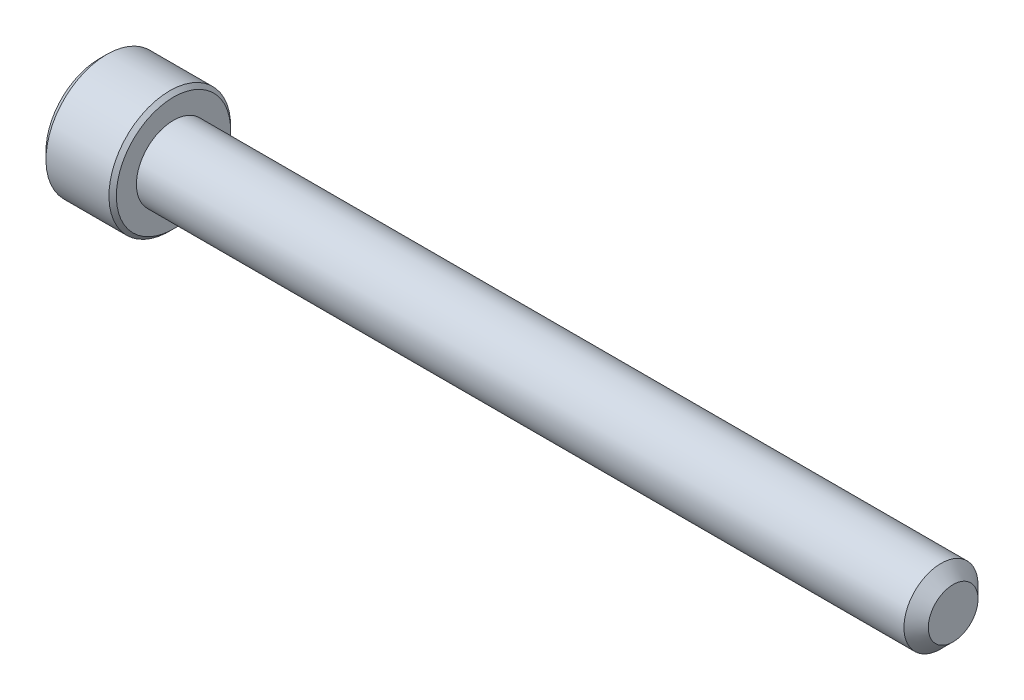
ISO-10303-21;
HEADER;
FILE_DESCRIPTION(('STEP AP214'),'2;1');
FILE_NAME('part.step','',(''),(''),'','','');
FILE_SCHEMA(('AUTOMOTIVE_DESIGN { 1 0 10303 214 1 1 1 1 }'));
ENDSEC;
DATA;
#1=APPLICATION_CONTEXT('core data for automotive mechanical design processes');
#2=APPLICATION_PROTOCOL_DEFINITION('international standard','automotive_design',2000,#1);
#3=PRODUCT_CONTEXT('',#1,'mechanical');
#4=PRODUCT('Part','Part','',(#3));
#5=PRODUCT_RELATED_PRODUCT_CATEGORY('part','',(#4));
#6=PRODUCT_DEFINITION_FORMATION('','',#4);
#7=PRODUCT_DEFINITION_CONTEXT('part definition',#1,'design');
#8=PRODUCT_DEFINITION('design','',#6,#7);
#9=PRODUCT_DEFINITION_SHAPE('','',#8);
#10=(LENGTH_UNIT() NAMED_UNIT(*) SI_UNIT(.MILLI.,.METRE.));
#11=(NAMED_UNIT(*) PLANE_ANGLE_UNIT() SI_UNIT($,.RADIAN.));
#12=(NAMED_UNIT(*) SI_UNIT($,.STERADIAN.) SOLID_ANGLE_UNIT());
#13=UNCERTAINTY_MEASURE_WITH_UNIT(LENGTH_MEASURE(1.E-05),#10,'distance_accuracy_value','');
#14=(GEOMETRIC_REPRESENTATION_CONTEXT(3) GLOBAL_UNCERTAINTY_ASSIGNED_CONTEXT((#13)) GLOBAL_UNIT_ASSIGNED_CONTEXT((#10,
#11,#12)) REPRESENTATION_CONTEXT('',''));
#15=CARTESIAN_POINT('',(0.,0.,0.));
#16=DIRECTION('',(0.,0.,1.));
#17=DIRECTION('',(1.,0.,0.));
#18=AXIS2_PLACEMENT_3D('',#15,#16,#17);
#19=CARTESIAN_POINT('',(-30.226,3.47979999999999,0.));
#20=DIRECTION('',(-1.,0.,0.));
#21=DIRECTION('',(0.,-1.,0.));
#22=AXIS2_PLACEMENT_3D('',#19,#20,#21);
#23=PLANE('',#22);
#24=CARTESIAN_POINT('',(-30.226,0.,0.));
#25=DIRECTION('',(-1.,0.,0.));
#26=DIRECTION('',(0.,-1.,0.));
#27=AXIS2_PLACEMENT_3D('',#24,#25,#26);
#28=CIRCLE('',#27,2.28769270663693);
#29=CARTESIAN_POINT('',(-30.226,-2.28769270663684,-2.29850860566927E-13));
#30=VERTEX_POINT('',#29);
#31=CARTESIAN_POINT('',(-30.226,-1.14384635331858,1.98119999999985));
#32=VERTEX_POINT('',#31);
#33=EDGE_CURVE('E129',#30,#32,#28,.T.);
#34=ORIENTED_EDGE('',*,*,#33,.F.);
#35=CARTESIAN_POINT('',(-30.226,-1.14384635331849,-1.9812));
#36=VERTEX_POINT('',#35);
#37=EDGE_CURVE('E128',#36,#30,#28,.T.);
#38=ORIENTED_EDGE('',*,*,#37,.F.);
#39=CARTESIAN_POINT('',(-30.226,1.14384635331849,-1.9812));
#40=VERTEX_POINT('',#39);
#41=EDGE_CURVE('E98',#40,#36,#28,.T.);
#42=ORIENTED_EDGE('',*,*,#41,.F.);
#43=CARTESIAN_POINT('',(-30.226,2.28769270663702,0.));
#44=VERTEX_POINT('',#43);
#45=EDGE_CURVE('E91',#44,#40,#28,.T.);
#46=ORIENTED_EDGE('',*,*,#45,.F.);
#47=CARTESIAN_POINT('',(-30.226,1.14384635331848,1.9812));
#48=VERTEX_POINT('',#47);
#49=EDGE_CURVE('E52',#48,#44,#28,.T.);
#50=ORIENTED_EDGE('',*,*,#49,.F.);
#51=EDGE_CURVE('E59',#32,#48,#28,.T.);
#52=ORIENTED_EDGE('',*,*,#51,.F.);
#53=EDGE_LOOP('',(#34,#38,#42,#46,#50,#52));
#54=FACE_BOUND('',#53,.T.);
#55=CARTESIAN_POINT('',(-30.226,0.,0.));
#56=DIRECTION('',(1.,0.,0.));
#57=DIRECTION('',(0.,1.,0.));
#58=AXIS2_PLACEMENT_3D('',#55,#56,#57);
#59=CIRCLE('',#58,3.4798);
#60=CARTESIAN_POINT('',(-30.226,3.47979999999999,0.));
#61=VERTEX_POINT('',#60);
#62=EDGE_CURVE('E217',#61,#61,#59,.T.);
#63=ORIENTED_EDGE('',*,*,#62,.F.);
#64=EDGE_LOOP('',(#63));
#65=FACE_BOUND('',#64,.T.);
#66=ADVANCED_FACE('F33',(#54,#65),#23,.T.);
#67=CARTESIAN_POINT('',(-25.4,0.,0.));
#68=DIRECTION('',(1.,0.,0.));
#69=DIRECTION('',(0.,0.,-1.));
#70=AXIS2_PLACEMENT_3D('',#67,#68,#69);
#71=CYLINDRICAL_SURFACE('',#70,2.41299999999999);
#72=CARTESIAN_POINT('',(24.60625,0.,0.));
#73=DIRECTION('',(1.,0.,0.));
#74=DIRECTION('',(0.,0.,-1.));
#75=AXIS2_PLACEMENT_3D('',#72,#73,#74);
#76=CIRCLE('',#75,2.41299999999999);
#77=CARTESIAN_POINT('',(24.60625,0.,-2.41299999999999));
#78=VERTEX_POINT('',#77);
#79=EDGE_CURVE('E46',#78,#78,#76,.F.);
#80=ORIENTED_EDGE('',*,*,#79,.T.);
#81=EDGE_LOOP('',(#80));
#82=FACE_BOUND('',#81,.T.);
#83=CARTESIAN_POINT('',(-25.4,0.,0.));
#84=DIRECTION('',(1.,0.,0.));
#85=DIRECTION('',(0.,1.,0.));
#86=AXIS2_PLACEMENT_3D('',#83,#84,#85);
#87=CIRCLE('',#86,2.41299999999999);
#88=CARTESIAN_POINT('',(-25.4,2.41299999999999,0.));
#89=VERTEX_POINT('',#88);
#90=EDGE_CURVE('E210',#89,#89,#87,.F.);
#91=ORIENTED_EDGE('',*,*,#90,.F.);
#92=EDGE_LOOP('',(#91));
#93=FACE_BOUND('',#92,.T.);
#94=ADVANCED_FACE('F190',(#82,#93),#71,.T.);
#95=CARTESIAN_POINT('',(25.4,0.,0.));
#96=DIRECTION('',(1.,0.,0.));
#97=DIRECTION('',(0.,0.,-1.));
#98=AXIS2_PLACEMENT_3D('',#95,#96,#97);
#99=PLANE('',#98);
#100=CARTESIAN_POINT('',(25.4,0.,0.));
#101=DIRECTION('',(1.,0.,0.));
#102=DIRECTION('',(0.,0.,-1.));
#103=AXIS2_PLACEMENT_3D('',#100,#101,#102);
#104=CIRCLE('',#103,1.61924999999999);
#105=CARTESIAN_POINT('',(25.4,0.,-1.61924999999999));
#106=VERTEX_POINT('',#105);
#107=EDGE_CURVE('E211',#106,#106,#104,.T.);
#108=ORIENTED_EDGE('',*,*,#107,.T.);
#109=EDGE_LOOP('',(#108));
#110=FACE_BOUND('',#109,.T.);
#111=ADVANCED_FACE('F198',(#110),#99,.T.);
#112=CARTESIAN_POINT('',(25.4,0.,0.));
#113=DIRECTION('',(-1.,0.,0.));
#114=DIRECTION('',(0.,0.,1.));
#115=AXIS2_PLACEMENT_3D('',#112,#113,#114);
#116=CONICAL_SURFACE('',#115,1.61924999999999,0.785398163397446);
#117=ORIENTED_EDGE('',*,*,#79,.F.);
#118=EDGE_LOOP('',(#117));
#119=FACE_BOUND('',#118,.T.);
#120=ORIENTED_EDGE('',*,*,#107,.F.);
#121=EDGE_LOOP('',(#120));
#122=FACE_BOUND('',#121,.T.);
#123=ADVANCED_FACE('F35',(#119,#122),#116,.T.);
#124=CARTESIAN_POINT('',(-25.4,0.,0.));
#125=DIRECTION('',(1.,0.,0.));
#126=DIRECTION('',(0.,1.,0.));
#127=AXIS2_PLACEMENT_3D('',#124,#125,#126);
#128=CYLINDRICAL_SURFACE('',#127,3.9624);
#129=CARTESIAN_POINT('',(-29.7434,0.,0.));
#130=DIRECTION('',(1.,0.,0.));
#131=DIRECTION('',(0.,1.,0.));
#132=AXIS2_PLACEMENT_3D('',#129,#130,#131);
#133=CIRCLE('',#132,3.9624);
#134=CARTESIAN_POINT('',(-29.7434,3.96239999999999,0.));
#135=VERTEX_POINT('',#134);
#136=EDGE_CURVE('E212',#135,#135,#133,.T.);
#137=ORIENTED_EDGE('',*,*,#136,.T.);
#138=EDGE_LOOP('',(#137));
#139=FACE_BOUND('',#138,.T.);
#140=CARTESIAN_POINT('',(-25.6413,0.,0.));
#141=DIRECTION('',(1.,0.,0.));
#142=DIRECTION('',(0.,1.,0.));
#143=AXIS2_PLACEMENT_3D('',#140,#141,#142);
#144=CIRCLE('',#143,3.9624);
#145=CARTESIAN_POINT('',(-25.6413,3.9624,0.));
#146=VERTEX_POINT('',#145);
#147=EDGE_CURVE('E225',#146,#146,#144,.T.);
#148=ORIENTED_EDGE('',*,*,#147,.F.);
#149=EDGE_LOOP('',(#148));
#150=FACE_BOUND('',#149,.T.);
#151=ADVANCED_FACE('F193',(#139,#150),#128,.T.);
#152=CARTESIAN_POINT('',(-29.7434,0.,0.));
#153=DIRECTION('',(1.,0.,0.));
#154=DIRECTION('',(0.,1.,0.));
#155=AXIS2_PLACEMENT_3D('',#152,#153,#154);
#156=CONICAL_SURFACE('',#155,3.9624,0.785398163397451);
#157=ORIENTED_EDGE('',*,*,#62,.T.);
#158=EDGE_LOOP('',(#157));
#159=FACE_BOUND('',#158,.T.);
#160=ORIENTED_EDGE('',*,*,#136,.F.);
#161=EDGE_LOOP('',(#160));
#162=FACE_BOUND('',#161,.T.);
#163=ADVANCED_FACE('F186',(#159,#162),#156,.T.);
#164=CARTESIAN_POINT('',(-25.4,3.7211,0.));
#165=DIRECTION('',(1.,0.,0.));
#166=DIRECTION('',(0.,1.,0.));
#167=AXIS2_PLACEMENT_3D('',#164,#165,#166);
#168=PLANE('',#167);
#169=ORIENTED_EDGE('',*,*,#90,.T.);
#170=EDGE_LOOP('',(#169));
#171=FACE_BOUND('',#170,.T.);
#172=CARTESIAN_POINT('',(-25.4,0.,0.));
#173=DIRECTION('',(1.,0.,0.));
#174=DIRECTION('',(0.,1.,0.));
#175=AXIS2_PLACEMENT_3D('',#172,#173,#174);
#176=CIRCLE('',#175,3.7211);
#177=CARTESIAN_POINT('',(-25.4,3.7211,0.));
#178=VERTEX_POINT('',#177);
#179=EDGE_CURVE('E222',#178,#178,#176,.T.);
#180=ORIENTED_EDGE('',*,*,#179,.T.);
#181=EDGE_LOOP('',(#180));
#182=FACE_BOUND('',#181,.T.);
#183=ADVANCED_FACE('F182',(#171,#182),#168,.T.);
#184=CARTESIAN_POINT('',(-25.4,0.,0.));
#185=DIRECTION('',(-1.,0.,0.));
#186=DIRECTION('',(0.,-1.,0.));
#187=AXIS2_PLACEMENT_3D('',#184,#185,#186);
#188=CONICAL_SURFACE('',#187,3.7211,0.785398163397448);
#189=ORIENTED_EDGE('',*,*,#147,.T.);
#190=EDGE_LOOP('',(#189));
#191=FACE_BOUND('',#190,.T.);
#192=ORIENTED_EDGE('',*,*,#179,.F.);
#193=EDGE_LOOP('',(#192));
#194=FACE_BOUND('',#193,.T.);
#195=ADVANCED_FACE('F149',(#191,#194),#188,.T.);
#196=CARTESIAN_POINT('',(-30.226,0.,0.));
#197=DIRECTION('',(-1.,0.,0.));
#198=DIRECTION('',(0.,-1.,0.));
#199=AXIS2_PLACEMENT_3D('',#196,#197,#198);
#200=CONICAL_SURFACE('',#199,2.28769270663693,0.78539816339745);
#201=CARTESIAN_POINT('',(-30.9865600777253,-2.31661209471328,-1.9812));
#202=CARTESIAN_POINT('',(-30.9438204101819,-2.2603614921634,-1.9812));
#203=CARTESIAN_POINT('',(-30.9014834228159,-2.20379992870606,-1.9812));
#204=CARTESIAN_POINT('',(-30.8177963532882,-2.08993070629047,-1.9812));
#205=CARTESIAN_POINT('',(-30.7764465165402,-2.03262286716362,-1.9812));
#206=CARTESIAN_POINT('',(-30.6946210740377,-1.91671767305174,-1.9812));
#207=CARTESIAN_POINT('',(-30.6541547119404,-1.85811377040503,-1.9812));
#208=CARTESIAN_POINT('',(-30.5746970580368,-1.73991751157362,-1.9812));
#209=CARTESIAN_POINT('',(-30.5357056629739,-1.68032522500334,-1.9812));
#210=CARTESIAN_POINT('',(-30.4572729813758,-1.55642857644237,-1.9812));
#211=CARTESIAN_POINT('',(-30.4179417996365,-1.49205415836947,-1.9812));
#212=CARTESIAN_POINT('',(-30.3418158217768,-1.36179799931495,-1.9812));
#213=CARTESIAN_POINT('',(-30.3050214801781,-1.29591599102244,-1.9812));
#214=CARTESIAN_POINT('',(-30.2347629165456,-1.16264841649048,-1.9812));
#215=CARTESIAN_POINT('',(-30.2012886854463,-1.09526816863771,-1.9812));
#216=CARTESIAN_POINT('',(-30.138413001948,-0.958638525880335,-1.9812));
#217=CARTESIAN_POINT('',(-30.1090101814703,-0.889389768225115,-1.9812));
#218=CARTESIAN_POINT('',(-30.0576670535846,-0.755011676695663,-1.9812));
#219=CARTESIAN_POINT('',(-30.0353004028526,-0.690046933259606,-1.9812));
#220=CARTESIAN_POINT('',(-29.9957743614793,-0.558522492136709,-1.9812));
#221=CARTESIAN_POINT('',(-29.9786153199098,-0.491962687853754,-1.9812));
#222=CARTESIAN_POINT('',(-29.9506968812676,-0.35876983400334,-1.9812));
#223=CARTESIAN_POINT('',(-29.9398256504206,-0.292160618416792,-1.9812));
#224=CARTESIAN_POINT('',(-29.9246994731351,-0.158191123948833,-1.9812));
#225=CARTESIAN_POINT('',(-29.9204433141166,-0.0908309849964729,-1.9812));
#226=CARTESIAN_POINT('',(-29.9188791538644,0.0413675255867971,-1.9812));
#227=CARTESIAN_POINT('',(-29.9213092898238,0.106202871329352,-1.9812));
#228=CARTESIAN_POINT('',(-29.9323974368111,0.235335017945305,-1.9812));
#229=CARTESIAN_POINT('',(-29.9410560404723,0.299631766982711,-1.9812));
#230=CARTESIAN_POINT('',(-29.9642695211888,0.42831037460898,-1.9812));
#231=CARTESIAN_POINT('',(-29.9789259856142,0.492673621191191,-1.9812));
#232=CARTESIAN_POINT('',(-30.0133456029653,0.619989310450822,-1.9812));
#233=CARTESIAN_POINT('',(-30.0331083735679,0.682941858367764,-1.9812));
#234=CARTESIAN_POINT('',(-30.1023096371758,0.879557414350364,-1.9812));
#235=CARTESIAN_POINT('',(-30.1595631983677,1.010461173405,-1.9812));
#236=CARTESIAN_POINT('',(-30.2869025411665,1.26614292755427,-1.9812));
#237=CARTESIAN_POINT('',(-30.3570341080232,1.39089698474677,-1.9812));
#238=CARTESIAN_POINT('',(-30.4665063539928,1.57122009754463,-1.9812));
#239=CARTESIAN_POINT('',(-30.502693344133,1.62874196367695,-1.9812));
#240=CARTESIAN_POINT('',(-30.5766029768938,1.74279825856359,-1.9812));
#241=CARTESIAN_POINT('',(-30.614325735426,1.7993326123238,-1.9812));
#242=CARTESIAN_POINT('',(-30.6907156093157,1.9110856137449,-1.9812));
#243=CARTESIAN_POINT('',(-30.729372617531,1.96631120499263,-1.9812));
#244=CARTESIAN_POINT('',(-30.8077142557783,2.07600654074471,-1.9812));
#245=CARTESIAN_POINT('',(-30.8473985999833,2.13047648914331,-1.9812));
#246=CARTESIAN_POINT('',(-30.8875039684054,2.18462985150372,-1.9812));
#247=B_SPLINE_CURVE_WITH_KNOTS('',3,(#201,#202,#203,#204,#205,#206,#207,#208,#209,#210,#211,
#212,#213,#214,#215,#216,#217,#218,#219,#220,#221,#222,#223,#224,#225,#226,#227,#228,#229,#230,
#231,#232,#233,#234,#235,#236,#237,#238,#239,#240,#241,#242,#243,#244,#245,#246),.UNSPECIFIED.,
.F.,.F.,(4,2,2,2,2,2,2,2,2,2,2,2,2,2,2,2,2,2,2,2,2,2,4),(0.,0.211941073069261,0.42393429897997,
0.637568344044451,0.85118740567587,1.07745720435396,1.30376743866492,1.52937324449065,
1.75490305715754,1.96084491037234,2.16680056504197,2.3689705744368,2.57110352055404,
2.76543396935549,2.95978291097833,3.15756960318856,3.35534149086081,3.7827240030036,
4.21165649261165,4.41551067240028,4.61938026665561,4.82160076405437,5.02376559149012),.UNSPECIFIED.);
#248=EDGE_CURVE('E11',#36,#40,#247,.T.);
#249=ORIENTED_EDGE('',*,*,#248,.T.);
#250=ORIENTED_EDGE('',*,*,#41,.T.);
#251=EDGE_LOOP('',(#249,#250));
#252=FACE_BOUND('',#251,.T.);
#253=ADVANCED_FACE('F103',(#252),#200,.F.);
#254=CARTESIAN_POINT('',(-30.226115478796,-2.28780817669081,0.000200000000000626));
#255=CARTESIAN_POINT('',(-30.1868257959103,-2.24848665761523,-0.0679068688696917));
#256=CARTESIAN_POINT('',(-30.1498435003289,-2.20850761153497,-0.137152607918836));
#257=CARTESIAN_POINT('',(-30.0821295256354,-2.12698582564064,-0.278352483011571));
#258=CARTESIAN_POINT('',(-30.0514355270599,-2.08543533121811,-0.350320050431004));
#259=CARTESIAN_POINT('',(-29.998855956616,-2.00165072213424,-0.495439250256557));
#260=CARTESIAN_POINT('',(-29.9768382144166,-1.95943794971066,-0.568553916822545));
#261=CARTESIAN_POINT('',(-29.9429151727618,-1.87408300871192,-0.716393011309414));
#262=CARTESIAN_POINT('',(-29.9309845470076,-1.83094344831493,-0.791112921733183));
#263=CARTESIAN_POINT('',(-29.9202201335962,-1.75659617238784,-0.919886181043241));
#264=CARTESIAN_POINT('',(-29.9186264854144,-1.72548453026022,-0.973773125915175));
#265=CARTESIAN_POINT('',(-29.9213101205948,-1.6633120865558,-1.08145895724194));
#266=CARTESIAN_POINT('',(-29.9255894623054,-1.63225130662553,-1.1352578062039));
#267=CARTESIAN_POINT('',(-29.9397755575124,-1.5704230164257,-1.24234754617512));
#268=CARTESIAN_POINT('',(-29.9496886071672,-1.53965587350492,-1.29563780091763));
#269=CARTESIAN_POINT('',(-29.9745979595727,-1.478653620299,-1.40129680284647));
#270=CARTESIAN_POINT('',(-29.9895938726795,-1.44841846941905,-1.45366562034505));
#271=CARTESIAN_POINT('',(-30.0341153639915,-1.37096856578664,-1.58781278847771));
#272=CARTESIAN_POINT('',(-30.066997840542,-1.32423416327347,-1.66875914809188));
#273=CARTESIAN_POINT('',(-30.1225083779863,-1.25551545359429,-1.78778344468681));
#274=CARTESIAN_POINT('',(-30.1420122911182,-1.23286958858003,-1.82700723347285));
#275=CARTESIAN_POINT('',(-30.1827981146138,-1.18799738117061,-1.90472817655373));
#276=CARTESIAN_POINT('',(-30.2040789329533,-1.16577079125223,-1.94322575957137));
#277=CARTESIAN_POINT('',(-30.2261154787959,-1.14373088326465,-1.9814));
#278=B_SPLINE_CURVE_WITH_KNOTS('',3,(#254,#255,#256,#257,#258,#259,#260,#261,#262,#263,#264,
#265,#266,#267,#268,#269,#270,#271,#272,#273,#274,#275,#276,#277),.UNSPECIFIED.,.F.,.F.,(4,2,2,
2,2,2,2,2,2,2,2,4),(0.,0.26391677446681,0.529371490731501,0.790609676105219,1.0511899914388,
1.23765676959447,1.42418891677611,1.61092994095409,1.79765665311273,2.09428646526811,
2.24219924134225,2.39002177516371),.UNSPECIFIED.);
#279=EDGE_CURVE('E131',#30,#36,#278,.T.);
#280=ORIENTED_EDGE('',*,*,#279,.T.);
#281=ORIENTED_EDGE('',*,*,#37,.T.);
#282=EDGE_LOOP('',(#280,#281));
#283=FACE_BOUND('',#282,.T.);
#284=ADVANCED_FACE('F148',(#283),#200,.F.);
#285=CARTESIAN_POINT('',(-30.2261154787959,-1.14373088326465,1.9814));
#286=CARTESIAN_POINT('',(-30.1868257959103,-1.18305240234023,1.91329313113031));
#287=CARTESIAN_POINT('',(-30.1498435003289,-1.22303144842048,1.84404739208117));
#288=CARTESIAN_POINT('',(-30.0821295256354,-1.30455323431481,1.70284751698845));
#289=CARTESIAN_POINT('',(-30.0514355270599,-1.34610372873734,1.63087994956902));
#290=CARTESIAN_POINT('',(-29.998855956616,-1.4298883378212,1.48576074974348));
#291=CARTESIAN_POINT('',(-29.9768382144166,-1.47210111024478,1.41264608317749));
#292=CARTESIAN_POINT('',(-29.9429151727618,-1.55745605124351,1.26480698869064));
#293=CARTESIAN_POINT('',(-29.9309845470076,-1.6005956116405,1.19008707826687));
#294=CARTESIAN_POINT('',(-29.9202201335962,-1.67494288756758,1.06131381895682));
#295=CARTESIAN_POINT('',(-29.9186264854144,-1.7060545296952,1.00742687408489));
#296=CARTESIAN_POINT('',(-29.9213101205948,-1.76822697339962,0.899741042758117));
#297=CARTESIAN_POINT('',(-29.9255894623054,-1.7992877533299,0.845942193796162));
#298=CARTESIAN_POINT('',(-29.9397755575124,-1.86111604352973,0.738852453824941));
#299=CARTESIAN_POINT('',(-29.9496886071672,-1.8918831864505,0.685562199082431));
#300=CARTESIAN_POINT('',(-29.9745979595727,-1.95288543965642,0.579903197153589));
#301=CARTESIAN_POINT('',(-29.9895938726795,-1.98312059053637,0.527534379655012));
#302=CARTESIAN_POINT('',(-30.0341153639915,-2.06057049416879,0.393387211522345));
#303=CARTESIAN_POINT('',(-30.066997840542,-2.10730489668196,0.312440851908157));
#304=CARTESIAN_POINT('',(-30.1225083779863,-2.17602360636116,0.193416555313217));
#305=CARTESIAN_POINT('',(-30.1420122911183,-2.19866947137542,0.154192766527167));
#306=CARTESIAN_POINT('',(-30.1827981146138,-2.24354167878484,0.0764718234462842));
#307=CARTESIAN_POINT('',(-30.2040789329534,-2.26576826870323,0.0379742404286395));
#308=CARTESIAN_POINT('',(-30.226115478796,-2.28780817669081,-0.000199999999999256));
#309=B_SPLINE_CURVE_WITH_KNOTS('',3,(#285,#286,#287,#288,#289,#290,#291,#292,#293,#294,#295,
#296,#297,#298,#299,#300,#301,#302,#303,#304,#305,#306,#307,#308),.UNSPECIFIED.,.F.,.F.,(4,2,2,
2,2,2,2,2,2,2,2,4),(0.,0.263916774466789,0.529371490731459,0.790609676105156,1.05118999143872,
1.23765676959439,1.42418891677603,1.61092994095401,1.79765665311265,2.09428646526807,
2.24219924134223,2.39002177516371),.UNSPECIFIED.);
#310=EDGE_CURVE('E137',#32,#30,#309,.T.);
#311=ORIENTED_EDGE('',*,*,#310,.T.);
#312=ORIENTED_EDGE('',*,*,#33,.T.);
#313=EDGE_LOOP('',(#311,#312));
#314=FACE_BOUND('',#313,.T.);
#315=ADVANCED_FACE('F258',(#314),#200,.F.);
#316=CARTESIAN_POINT('',(-30.9865600777253,-2.31661209471328,1.9812));
#317=CARTESIAN_POINT('',(-30.9438204101819,-2.2603614921634,1.9812));
#318=CARTESIAN_POINT('',(-30.9014834228159,-2.20379992870606,1.9812));
#319=CARTESIAN_POINT('',(-30.8177963532882,-2.08993070629047,1.9812));
#320=CARTESIAN_POINT('',(-30.7764465165402,-2.03262286716362,1.9812));
#321=CARTESIAN_POINT('',(-30.6946210740377,-1.91671767305173,1.9812));
#322=CARTESIAN_POINT('',(-30.6541547119404,-1.85811377040503,1.9812));
#323=CARTESIAN_POINT('',(-30.5746970580368,-1.73991751157362,1.9812));
#324=CARTESIAN_POINT('',(-30.5357056629739,-1.68032522500334,1.9812));
#325=CARTESIAN_POINT('',(-30.4572729813758,-1.55642857644237,1.9812));
#326=CARTESIAN_POINT('',(-30.4179417996365,-1.49205415836947,1.9812));
#327=CARTESIAN_POINT('',(-30.3418158217768,-1.36179799931495,1.9812));
#328=CARTESIAN_POINT('',(-30.3050214801781,-1.29591599102244,1.9812));
#329=CARTESIAN_POINT('',(-30.2347629165456,-1.16264841649048,1.9812));
#330=CARTESIAN_POINT('',(-30.2012886854463,-1.0952681686377,1.9812));
#331=CARTESIAN_POINT('',(-30.138413001948,-0.958638525880333,1.9812));
#332=CARTESIAN_POINT('',(-30.1090101814703,-0.889389768225113,1.9812));
#333=CARTESIAN_POINT('',(-30.0576670535846,-0.755011676695663,1.9812));
#334=CARTESIAN_POINT('',(-30.0353004028526,-0.690046933259605,1.9812));
#335=CARTESIAN_POINT('',(-29.9957743614793,-0.558522492136708,1.9812));
#336=CARTESIAN_POINT('',(-29.9786153199098,-0.491962687853753,1.9812));
#337=CARTESIAN_POINT('',(-29.9506968812676,-0.358769834003338,1.9812));
#338=CARTESIAN_POINT('',(-29.9398256504206,-0.292160618416791,1.9812));
#339=CARTESIAN_POINT('',(-29.9246994731351,-0.158191123948832,1.9812));
#340=CARTESIAN_POINT('',(-29.9204433141166,-0.0908309849964719,1.9812));
#341=CARTESIAN_POINT('',(-29.9188791538644,0.041367525586798,1.9812));
#342=CARTESIAN_POINT('',(-29.9213092898238,0.106202871329352,1.9812));
#343=CARTESIAN_POINT('',(-29.9323974368111,0.235335017945306,1.9812));
#344=CARTESIAN_POINT('',(-29.9410560404723,0.299631766982712,1.9812));
#345=CARTESIAN_POINT('',(-29.9642695211888,0.428310374608981,1.9812));
#346=CARTESIAN_POINT('',(-29.9789259856142,0.492673621191193,1.9812));
#347=CARTESIAN_POINT('',(-30.0133456029653,0.619989310450825,1.9812));
#348=CARTESIAN_POINT('',(-30.0331083735679,0.682941858367766,1.9812));
#349=CARTESIAN_POINT('',(-30.1023096371758,0.879557414350365,1.9812));
#350=CARTESIAN_POINT('',(-30.1595631983677,1.010461173405,1.9812));
#351=CARTESIAN_POINT('',(-30.2869025411665,1.26614292755427,1.9812));
#352=CARTESIAN_POINT('',(-30.3570341080232,1.39089698474677,1.9812));
#353=CARTESIAN_POINT('',(-30.4665063539928,1.57122009754464,1.9812));
#354=CARTESIAN_POINT('',(-30.502693344133,1.62874196367696,1.9812));
#355=CARTESIAN_POINT('',(-30.5766029768938,1.7427982585636,1.9812));
#356=CARTESIAN_POINT('',(-30.614325735426,1.7993326123238,1.9812));
#357=CARTESIAN_POINT('',(-30.6907156093157,1.91108561374491,1.9812));
#358=CARTESIAN_POINT('',(-30.729372617531,1.96631120499263,1.9812));
#359=CARTESIAN_POINT('',(-30.8077142557783,2.07600654074471,1.9812));
#360=CARTESIAN_POINT('',(-30.8473985999833,2.13047648914332,1.9812));
#361=CARTESIAN_POINT('',(-30.8875039684054,2.18462985150372,1.9812));
#362=B_SPLINE_CURVE_WITH_KNOTS('',3,(#316,#317,#318,#319,#320,#321,#322,#323,#324,#325,#326,
#327,#328,#329,#330,#331,#332,#333,#334,#335,#336,#337,#338,#339,#340,#341,#342,#343,#344,#345,
#346,#347,#348,#349,#350,#351,#352,#353,#354,#355,#356,#357,#358,#359,#360,#361),.UNSPECIFIED.,
.F.,.F.,(4,2,2,2,2,2,2,2,2,2,2,2,2,2,2,2,2,2,2,2,2,2,4),(0.,0.211941073069261,0.42393429897997,
0.637568344044451,0.85118740567587,1.07745720435396,1.30376743866492,1.52937324449065,
1.75490305715754,1.96084491037234,2.16680056504197,2.3689705744368,2.57110352055404,
2.76543396935549,2.95978291097833,3.15756960318856,3.35534149086082,3.7827240030036,
4.21165649261165,4.41551067240028,4.61938026665562,4.82160076405437,5.02376559149013),.UNSPECIFIED.);
#363=EDGE_CURVE('E156',#48,#32,#362,.F.);
#364=ORIENTED_EDGE('',*,*,#363,.T.);
#365=ORIENTED_EDGE('',*,*,#51,.T.);
#366=EDGE_LOOP('',(#364,#365));
#367=FACE_BOUND('',#366,.T.);
#368=ADVANCED_FACE('F274',(#367),#200,.F.);
#369=CARTESIAN_POINT('',(-30.2261154787958,2.28780817669081,-0.000199999999999572));
#370=CARTESIAN_POINT('',(-30.1868257959102,2.24848665761523,0.0679068688696886));
#371=CARTESIAN_POINT('',(-30.1498435003287,2.20850761153498,0.137152607918827));
#372=CARTESIAN_POINT('',(-30.0821295256353,2.12698582564065,0.278352483011551));
#373=CARTESIAN_POINT('',(-30.0514355270598,2.08543533121812,0.350320050430979));
#374=CARTESIAN_POINT('',(-29.9988559566158,2.00165072213426,0.495439250256521));
#375=CARTESIAN_POINT('',(-29.9768382144164,1.95943794971068,0.568553916822504));
#376=CARTESIAN_POINT('',(-29.9429151727616,1.87408300871195,0.716393011309361));
#377=CARTESIAN_POINT('',(-29.9309845470074,1.83094344831496,0.791112921733124));
#378=CARTESIAN_POINT('',(-29.9202201335961,1.75659617238788,0.919886181043174));
#379=CARTESIAN_POINT('',(-29.9186264854143,1.72548453026026,0.973773125915103));
#380=CARTESIAN_POINT('',(-29.9213101205947,1.66331208655585,1.08145895724186));
#381=CARTESIAN_POINT('',(-29.9255894623052,1.63225130662558,1.13525780620382));
#382=CARTESIAN_POINT('',(-29.9397755575122,1.57042301642575,1.24234754617503));
#383=CARTESIAN_POINT('',(-29.949688607167,1.53965587350498,1.29563780091754));
#384=CARTESIAN_POINT('',(-29.9745979595725,1.47865362029906,1.40129680284637));
#385=CARTESIAN_POINT('',(-29.9895938726794,1.44841846941911,1.45366562034494));
#386=CARTESIAN_POINT('',(-30.0341153639914,1.37096856578669,1.58781278847762));
#387=CARTESIAN_POINT('',(-30.0669978405418,1.32423416327351,1.66875914809181));
#388=CARTESIAN_POINT('',(-30.1225083779862,1.25551545359431,1.78778344468677));
#389=CARTESIAN_POINT('',(-30.1420122911181,1.23286958858005,1.82700723347282));
#390=CARTESIAN_POINT('',(-30.1827981146137,1.18799738117062,1.90472817655371));
#391=CARTESIAN_POINT('',(-30.2040789329532,1.16577079125223,1.94322575957136));
#392=CARTESIAN_POINT('',(-30.2261154787958,1.14373088326465,1.9814));
#393=B_SPLINE_CURVE_WITH_KNOTS('',3,(#369,#370,#371,#372,#373,#374,#375,#376,#377,#378,#379,
#380,#381,#382,#383,#384,#385,#386,#387,#388,#389,#390,#391,#392),.UNSPECIFIED.,.F.,.F.,(4,2,2,
2,2,2,2,2,2,2,2,4),(0.,0.263916774466789,0.52937149073146,0.790609676105156,1.05118999143872,
1.23765676959438,1.424188916776,1.61092994095397,1.7976566531126,2.09428646526805,
2.24219924134222,2.39002177516373),.UNSPECIFIED.);
#394=EDGE_CURVE('E118',#44,#48,#393,.T.);
#395=ORIENTED_EDGE('',*,*,#394,.T.);
#396=ORIENTED_EDGE('',*,*,#49,.T.);
#397=EDGE_LOOP('',(#395,#396));
#398=FACE_BOUND('',#397,.T.);
#399=ADVANCED_FACE('F250',(#398),#200,.F.);
#400=CARTESIAN_POINT('',(-30.2261154787958,1.14373088326465,-1.9814));
#401=CARTESIAN_POINT('',(-30.1868257959102,1.18305240234023,-1.91329313113031));
#402=CARTESIAN_POINT('',(-30.1498435003288,1.22303144842049,-1.84404739208116));
#403=CARTESIAN_POINT('',(-30.0821295256353,1.30455323431482,-1.70284751698843));
#404=CARTESIAN_POINT('',(-30.0514355270598,1.34610372873735,-1.630879949569));
#405=CARTESIAN_POINT('',(-29.9988559566158,1.42988833782121,-1.48576074974345));
#406=CARTESIAN_POINT('',(-29.9768382144164,1.4721011102448,-1.41264608317746));
#407=CARTESIAN_POINT('',(-29.9429151727616,1.55745605124354,-1.26480698869059));
#408=CARTESIAN_POINT('',(-29.9309845470074,1.60059561164053,-1.19008707826682));
#409=CARTESIAN_POINT('',(-29.9202201335961,1.67494288756761,-1.06131381895677));
#410=CARTESIAN_POINT('',(-29.9186264854143,1.70605452969523,-1.00742687408484));
#411=CARTESIAN_POINT('',(-29.9213101205947,1.76822697339964,-0.899741042758074));
#412=CARTESIAN_POINT('',(-29.9255894623052,1.79928775332992,-0.845942193796122));
#413=CARTESIAN_POINT('',(-29.9397755575122,1.86111604352975,-0.738852453824908));
#414=CARTESIAN_POINT('',(-29.949688607167,1.89188318645052,-0.685562199082402));
#415=CARTESIAN_POINT('',(-29.9745979595725,1.95288543965644,-0.579903197153566));
#416=CARTESIAN_POINT('',(-29.9895938726794,1.98312059053638,-0.527534379654992));
#417=CARTESIAN_POINT('',(-30.0341153639913,2.0605704941688,-0.39338721152233));
#418=CARTESIAN_POINT('',(-30.0669978405418,2.10730489668197,-0.312440851908145));
#419=CARTESIAN_POINT('',(-30.1225083779862,2.17602360636116,-0.193416555313208));
#420=CARTESIAN_POINT('',(-30.1420122911181,2.19866947137542,-0.154192766527161));
#421=CARTESIAN_POINT('',(-30.1827981146136,2.24354167878484,-0.0764718234462803));
#422=CARTESIAN_POINT('',(-30.2040789329532,2.26576826870323,-0.0379742404286367));
#423=CARTESIAN_POINT('',(-30.2261154787958,2.28780817669081,0.000200000000000448));
#424=B_SPLINE_CURVE_WITH_KNOTS('',3,(#400,#401,#402,#403,#404,#405,#406,#407,#408,#409,#410,
#411,#412,#413,#414,#415,#416,#417,#418,#419,#420,#421,#422,#423),.UNSPECIFIED.,.F.,.F.,(4,2,2,
2,2,2,2,2,2,2,2,4),(0.,0.263916774466809,0.529371490731501,0.790609676105218,1.0511899914388,
1.23765676959446,1.42418891677608,1.61092994095405,1.79765665311268,2.0942864652681,
2.24219924134224,2.39002177516373),.UNSPECIFIED.);
#425=EDGE_CURVE('E94',#40,#44,#424,.T.);
#426=ORIENTED_EDGE('',*,*,#425,.T.);
#427=ORIENTED_EDGE('',*,*,#45,.T.);
#428=EDGE_LOOP('',(#426,#427));
#429=FACE_BOUND('',#428,.T.);
#430=ADVANCED_FACE('F92',(#429),#200,.F.);
#431=CARTESIAN_POINT('',(-27.94,2.28769270663697,0.));
#432=DIRECTION('',(1.,0.,0.));
#433=DIRECTION('',(0.,0.,-1.));
#434=AXIS2_PLACEMENT_3D('',#431,#432,#433);
#435=PLANE('',#434);
#436=DIRECTION('',(0.,0.5,0.866025403784439));
#437=VECTOR('',#436,1.);
#438=CARTESIAN_POINT('',(-27.94,1.14384635331849,-1.9812));
#439=LINE('',#438,#437);
#440=CARTESIAN_POINT('',(-27.94,1.14384635331849,-1.9812));
#441=VERTEX_POINT('',#440);
#442=CARTESIAN_POINT('',(-27.94,2.28769270663697,0.));
#443=VERTEX_POINT('',#442);
#444=EDGE_CURVE('E117',#441,#443,#439,.T.);
#445=ORIENTED_EDGE('',*,*,#444,.F.);
#446=DIRECTION('',(0.,1.,0.));
#447=VECTOR('',#446,1.);
#448=CARTESIAN_POINT('',(-27.94,-1.14384635331849,-1.9812));
#449=LINE('',#448,#447);
#450=CARTESIAN_POINT('',(-27.94,-1.14384635331849,-1.9812));
#451=VERTEX_POINT('',#450);
#452=EDGE_CURVE('E122',#451,#441,#449,.T.);
#453=ORIENTED_EDGE('',*,*,#452,.F.);
#454=DIRECTION('',(0.,0.5,-0.866025403784439));
#455=VECTOR('',#454,1.);
#456=CARTESIAN_POINT('',(-27.94,-2.28769270663697,0.));
#457=LINE('',#456,#455);
#458=CARTESIAN_POINT('',(-27.94,-2.28769270663697,0.));
#459=VERTEX_POINT('',#458);
#460=EDGE_CURVE('E240',#459,#451,#457,.T.);
#461=ORIENTED_EDGE('',*,*,#460,.F.);
#462=DIRECTION('',(0.,-0.5,-0.866025403784439));
#463=VECTOR('',#462,1.);
#464=CARTESIAN_POINT('',(-27.94,-1.14384635331849,1.9812));
#465=LINE('',#464,#463);
#466=CARTESIAN_POINT('',(-27.94,-1.14384635331849,1.9812));
#467=VERTEX_POINT('',#466);
#468=EDGE_CURVE('E242',#467,#459,#465,.T.);
#469=ORIENTED_EDGE('',*,*,#468,.F.);
#470=DIRECTION('',(0.,-1.,0.));
#471=VECTOR('',#470,1.);
#472=CARTESIAN_POINT('',(-27.94,1.14384635331849,1.9812));
#473=LINE('',#472,#471);
#474=CARTESIAN_POINT('',(-27.94,1.14384635331849,1.9812));
#475=VERTEX_POINT('',#474);
#476=EDGE_CURVE('E244',#475,#467,#473,.T.);
#477=ORIENTED_EDGE('',*,*,#476,.F.);
#478=DIRECTION('',(0.,-0.5,0.866025403784439));
#479=VECTOR('',#478,1.);
#480=CARTESIAN_POINT('',(-27.94,2.28769270663697,0.));
#481=LINE('',#480,#479);
#482=EDGE_CURVE('E246',#443,#475,#481,.T.);
#483=ORIENTED_EDGE('',*,*,#482,.F.);
#484=EDGE_LOOP('',(#445,#453,#461,#469,#477,#483));
#485=FACE_BOUND('',#484,.T.);
#486=ADVANCED_FACE('F150',(#485),#435,.F.);
#487=CARTESIAN_POINT('',(-27.94,-1.14384635331849,-1.9812));
#488=DIRECTION('',(0.,0.,1.));
#489=DIRECTION('',(1.,0.,0.));
#490=AXIS2_PLACEMENT_3D('',#487,#488,#489);
#491=PLANE('',#490);
#492=ORIENTED_EDGE('',*,*,#248,.F.);
#493=DIRECTION('',(-1.,0.,0.));
#494=VECTOR('',#493,1.);
#495=CARTESIAN_POINT('',(-27.94,-1.14384635331849,-1.9812));
#496=LINE('',#495,#494);
#497=EDGE_CURVE('E123',#451,#36,#496,.T.);
#498=ORIENTED_EDGE('',*,*,#497,.F.);
#499=ORIENTED_EDGE('',*,*,#452,.T.);
#500=DIRECTION('',(-1.,0.,0.));
#501=VECTOR('',#500,1.);
#502=CARTESIAN_POINT('',(-27.94,1.14384635331849,-1.9812));
#503=LINE('',#502,#501);
#504=EDGE_CURVE('E113',#441,#40,#503,.T.);
#505=ORIENTED_EDGE('',*,*,#504,.T.);
#506=EDGE_LOOP('',(#492,#498,#499,#505));
#507=FACE_BOUND('',#506,.T.);
#508=ADVANCED_FACE('F120',(#507),#491,.T.);
#509=CARTESIAN_POINT('',(-27.94,-2.28769270663697,0.));
#510=DIRECTION('',(0.,0.866025403784439,0.5));
#511=DIRECTION('',(0.,-0.5,0.866025403784439));
#512=AXIS2_PLACEMENT_3D('',#509,#510,#511);
#513=PLANE('',#512);
#514=ORIENTED_EDGE('',*,*,#279,.F.);
#515=DIRECTION('',(-1.,0.,0.));
#516=VECTOR('',#515,1.);
#517=CARTESIAN_POINT('',(-27.94,-2.28769270663697,0.));
#518=LINE('',#517,#516);
#519=EDGE_CURVE('E235',#459,#30,#518,.T.);
#520=ORIENTED_EDGE('',*,*,#519,.F.);
#521=ORIENTED_EDGE('',*,*,#460,.T.);
#522=ORIENTED_EDGE('',*,*,#497,.T.);
#523=EDGE_LOOP('',(#514,#520,#521,#522));
#524=FACE_BOUND('',#523,.T.);
#525=ADVANCED_FACE('F143',(#524),#513,.T.);
#526=CARTESIAN_POINT('',(-27.94,-1.14384635331849,1.9812));
#527=DIRECTION('',(0.,0.866025403784439,-0.5));
#528=DIRECTION('',(0.,0.5,0.866025403784439));
#529=AXIS2_PLACEMENT_3D('',#526,#527,#528);
#530=PLANE('',#529);
#531=ORIENTED_EDGE('',*,*,#310,.F.);
#532=DIRECTION('',(-1.,0.,0.));
#533=VECTOR('',#532,1.);
#534=CARTESIAN_POINT('',(-27.94,-1.14384635331849,1.9812));
#535=LINE('',#534,#533);
#536=EDGE_CURVE('E232',#467,#32,#535,.T.);
#537=ORIENTED_EDGE('',*,*,#536,.F.);
#538=ORIENTED_EDGE('',*,*,#468,.T.);
#539=ORIENTED_EDGE('',*,*,#519,.T.);
#540=EDGE_LOOP('',(#531,#537,#538,#539));
#541=FACE_BOUND('',#540,.T.);
#542=ADVANCED_FACE('F264',(#541),#530,.T.);
#543=CARTESIAN_POINT('',(-27.94,1.14384635331849,1.9812));
#544=DIRECTION('',(0.,0.,-1.));
#545=DIRECTION('',(-1.,0.,0.));
#546=AXIS2_PLACEMENT_3D('',#543,#544,#545);
#547=PLANE('',#546);
#548=ORIENTED_EDGE('',*,*,#363,.F.);
#549=DIRECTION('',(-1.,0.,0.));
#550=VECTOR('',#549,1.);
#551=CARTESIAN_POINT('',(-27.94,1.14384635331849,1.9812));
#552=LINE('',#551,#550);
#553=EDGE_CURVE('E229',#475,#48,#552,.T.);
#554=ORIENTED_EDGE('',*,*,#553,.F.);
#555=ORIENTED_EDGE('',*,*,#476,.T.);
#556=ORIENTED_EDGE('',*,*,#536,.T.);
#557=EDGE_LOOP('',(#548,#554,#555,#556));
#558=FACE_BOUND('',#557,.T.);
#559=ADVANCED_FACE('F174',(#558),#547,.T.);
#560=CARTESIAN_POINT('',(-27.94,2.28769270663697,0.));
#561=DIRECTION('',(0.,-0.866025403784439,-0.5));
#562=DIRECTION('',(0.,0.5,-0.866025403784439));
#563=AXIS2_PLACEMENT_3D('',#560,#561,#562);
#564=PLANE('',#563);
#565=ORIENTED_EDGE('',*,*,#394,.F.);
#566=DIRECTION('',(-1.,0.,0.));
#567=VECTOR('',#566,1.);
#568=CARTESIAN_POINT('',(-27.94,2.28769270663697,0.));
#569=LINE('',#568,#567);
#570=EDGE_CURVE('E116',#443,#44,#569,.T.);
#571=ORIENTED_EDGE('',*,*,#570,.F.);
#572=ORIENTED_EDGE('',*,*,#482,.T.);
#573=ORIENTED_EDGE('',*,*,#553,.T.);
#574=EDGE_LOOP('',(#565,#571,#572,#573));
#575=FACE_BOUND('',#574,.T.);
#576=ADVANCED_FACE('F171',(#575),#564,.T.);
#577=CARTESIAN_POINT('',(-27.94,1.14384635331849,-1.9812));
#578=DIRECTION('',(0.,-0.866025403784439,0.5));
#579=DIRECTION('',(0.,-0.5,-0.866025403784439));
#580=AXIS2_PLACEMENT_3D('',#577,#578,#579);
#581=PLANE('',#580);
#582=ORIENTED_EDGE('',*,*,#425,.F.);
#583=ORIENTED_EDGE('',*,*,#504,.F.);
#584=ORIENTED_EDGE('',*,*,#444,.T.);
#585=ORIENTED_EDGE('',*,*,#570,.T.);
#586=EDGE_LOOP('',(#582,#583,#584,#585));
#587=FACE_BOUND('',#586,.T.);
#588=ADVANCED_FACE('F111',(#587),#581,.T.);
#589=CLOSED_SHELL('',(#66,#94,#111,#123,#151,#163,#183,#195,#253,#284,#315,#368,#399,#430,#486,
#508,#525,#542,#559,#576,#588));
#590=MANIFOLD_SOLID_BREP('B2',#589);
#591=ADVANCED_BREP_SHAPE_REPRESENTATION('',(#18,#590),#14);
#592=SHAPE_DEFINITION_REPRESENTATION(#9,#591);
ENDSEC;
END-ISO-10303-21;
